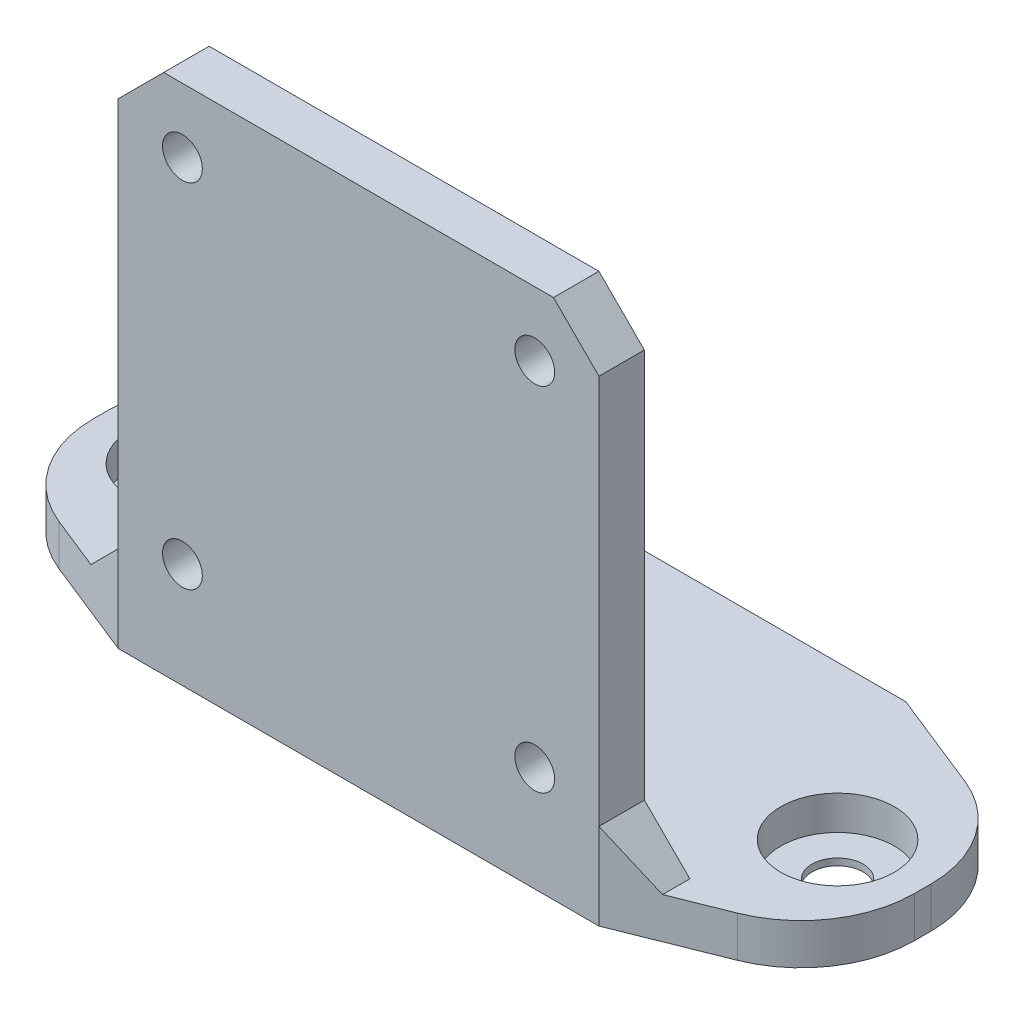
ISO-10303-21;
HEADER;
FILE_DESCRIPTION(('STEP AP214'),'2;1');
FILE_NAME('part.step','',(''),(''),'','','');
FILE_SCHEMA(('AUTOMOTIVE_DESIGN { 1 0 10303 214 1 1 1 1 }'));
ENDSEC;
DATA;
#1=APPLICATION_CONTEXT('core data for automotive mechanical design processes');
#2=APPLICATION_PROTOCOL_DEFINITION('international standard','automotive_design',2000,#1);
#3=PRODUCT_CONTEXT('',#1,'mechanical');
#4=PRODUCT('Part','Part','',(#3));
#5=PRODUCT_RELATED_PRODUCT_CATEGORY('part','',(#4));
#6=PRODUCT_DEFINITION_FORMATION('','',#4);
#7=PRODUCT_DEFINITION_CONTEXT('part definition',#1,'design');
#8=PRODUCT_DEFINITION('design','',#6,#7);
#9=PRODUCT_DEFINITION_SHAPE('','',#8);
#10=(LENGTH_UNIT() NAMED_UNIT(*) SI_UNIT(.MILLI.,.METRE.));
#11=(NAMED_UNIT(*) PLANE_ANGLE_UNIT() SI_UNIT($,.RADIAN.));
#12=(NAMED_UNIT(*) SI_UNIT($,.STERADIAN.) SOLID_ANGLE_UNIT());
#13=UNCERTAINTY_MEASURE_WITH_UNIT(LENGTH_MEASURE(1.E-05),#10,'distance_accuracy_value','');
#14=(GEOMETRIC_REPRESENTATION_CONTEXT(3) GLOBAL_UNCERTAINTY_ASSIGNED_CONTEXT((#13)) GLOBAL_UNIT_ASSIGNED_CONTEXT((#10,
#11,#12)) REPRESENTATION_CONTEXT('',''));
#15=CARTESIAN_POINT('',(0.,0.,0.));
#16=DIRECTION('',(0.,0.,1.));
#17=DIRECTION('',(1.,0.,0.));
#18=AXIS2_PLACEMENT_3D('',#15,#16,#17);
#19=CARTESIAN_POINT('',(0.,3.6,0.));
#20=DIRECTION('',(1.,0.,0.));
#21=DIRECTION('',(0.,0.,-1.));
#22=AXIS2_PLACEMENT_3D('',#19,#20,#21);
#23=PLANE('',#22);
#24=DIRECTION('',(0.,0.,1.));
#25=VECTOR('',#24,1.);
#26=CARTESIAN_POINT('',(0.,3.6,0.));
#27=LINE('',#26,#25);
#28=CARTESIAN_POINT('',(0.,3.6,12.770329614269));
#29=VERTEX_POINT('',#28);
#30=CARTESIAN_POINT('',(0.,3.6,14.229670385731));
#31=VERTEX_POINT('',#30);
#32=EDGE_CURVE('E200',#29,#31,#27,.T.);
#33=ORIENTED_EDGE('',*,*,#32,.F.);
#34=DIRECTION('',(0.,1.,0.));
#35=VECTOR('',#34,1.);
#36=CARTESIAN_POINT('',(0.,3.6,12.770329614269));
#37=LINE('',#36,#35);
#38=CARTESIAN_POINT('',(0.,0.,12.770329614269));
#39=VERTEX_POINT('',#38);
#40=EDGE_CURVE('E293',#29,#39,#37,.F.);
#41=ORIENTED_EDGE('',*,*,#40,.T.);
#42=DIRECTION('',(0.,0.,1.));
#43=VECTOR('',#42,1.);
#44=CARTESIAN_POINT('',(0.,0.,0.));
#45=LINE('',#44,#43);
#46=CARTESIAN_POINT('',(0.,0.,14.229670385731));
#47=VERTEX_POINT('',#46);
#48=EDGE_CURVE('E204',#39,#47,#45,.T.);
#49=ORIENTED_EDGE('',*,*,#48,.T.);
#50=DIRECTION('',(0.,1.,0.));
#51=VECTOR('',#50,1.);
#52=CARTESIAN_POINT('',(0.,3.6,14.229670385731));
#53=LINE('',#52,#51);
#54=EDGE_CURVE('E290',#47,#31,#53,.T.);
#55=ORIENTED_EDGE('',*,*,#54,.T.);
#56=EDGE_LOOP('',(#33,#41,#49,#55));
#57=FACE_BOUND('',#56,.T.);
#58=ADVANCED_FACE('F39',(#57),#23,.F.);
#59=CARTESIAN_POINT('',(0.,3.6,27.));
#60=DIRECTION('',(0.,0.,-1.));
#61=DIRECTION('',(-1.,0.,0.));
#62=AXIS2_PLACEMENT_3D('',#59,#60,#61);
#63=PLANE('',#62);
#64=CARTESIAN_POINT('',(20.65,9.24999999999999,27.));
#65=DIRECTION('',(0.,0.,1.));
#66=DIRECTION('',(1.,0.,0.));
#67=AXIS2_PLACEMENT_3D('',#64,#65,#66);
#68=CIRCLE('',#67,1.75);
#69=CARTESIAN_POINT('',(22.4,9.24999999999999,27.));
#70=VERTEX_POINT('',#69);
#71=EDGE_CURVE('E231',#70,#70,#68,.T.);
#72=ORIENTED_EDGE('',*,*,#71,.F.);
#73=EDGE_LOOP('',(#72));
#74=FACE_BOUND('',#73,.T.);
#75=CARTESIAN_POINT('',(51.65,9.24999999999999,27.));
#76=DIRECTION('',(0.,0.,1.));
#77=DIRECTION('',(1.,0.,0.));
#78=AXIS2_PLACEMENT_3D('',#75,#76,#77);
#79=CIRCLE('',#78,1.75);
#80=CARTESIAN_POINT('',(53.4,9.24999999999999,27.));
#81=VERTEX_POINT('',#80);
#82=EDGE_CURVE('E388',#81,#81,#79,.T.);
#83=ORIENTED_EDGE('',*,*,#82,.F.);
#84=EDGE_LOOP('',(#83));
#85=FACE_BOUND('',#84,.T.);
#86=CARTESIAN_POINT('',(51.65,40.25,27.));
#87=DIRECTION('',(0.,0.,1.));
#88=DIRECTION('',(1.,0.,0.));
#89=AXIS2_PLACEMENT_3D('',#86,#87,#88);
#90=CIRCLE('',#89,1.75);
#91=CARTESIAN_POINT('',(53.4,40.25,27.));
#92=VERTEX_POINT('',#91);
#93=EDGE_CURVE('E385',#92,#92,#90,.T.);
#94=ORIENTED_EDGE('',*,*,#93,.F.);
#95=EDGE_LOOP('',(#94));
#96=FACE_BOUND('',#95,.T.);
#97=CARTESIAN_POINT('',(20.65,40.25,27.));
#98=DIRECTION('',(0.,0.,1.));
#99=DIRECTION('',(1.,0.,0.));
#100=AXIS2_PLACEMENT_3D('',#97,#98,#99);
#101=CIRCLE('',#100,1.75);
#102=CARTESIAN_POINT('',(22.4,40.25,27.));
#103=VERTEX_POINT('',#102);
#104=EDGE_CURVE('E218',#103,#103,#101,.T.);
#105=ORIENTED_EDGE('',*,*,#104,.F.);
#106=EDGE_LOOP('',(#105));
#107=FACE_BOUND('',#106,.T.);
#108=DIRECTION('',(0.,-1.,0.));
#109=VECTOR('',#108,1.);
#110=CARTESIAN_POINT('',(57.3,45.9,27.));
#111=LINE('',#110,#109);
#112=CARTESIAN_POINT('',(57.3,41.9,27.));
#113=VERTEX_POINT('',#112);
#114=CARTESIAN_POINT('',(57.3,7.60000000000003,27.));
#115=VERTEX_POINT('',#114);
#116=EDGE_CURVE('E343',#113,#115,#111,.T.);
#117=ORIENTED_EDGE('',*,*,#116,.F.);
#118=DIRECTION('',(0.707106781186546,-0.707106781186549,0.));
#119=VECTOR('',#118,1.);
#120=CARTESIAN_POINT('',(53.3,45.9,27.));
#121=LINE('',#120,#119);
#122=CARTESIAN_POINT('',(53.3,45.9,27.));
#123=VERTEX_POINT('',#122);
#124=EDGE_CURVE('E258',#113,#123,#121,.F.);
#125=ORIENTED_EDGE('',*,*,#124,.T.);
#126=DIRECTION('',(1.,0.,0.));
#127=VECTOR('',#126,1.);
#128=CARTESIAN_POINT('',(15.,45.9,27.));
#129=LINE('',#128,#127);
#130=CARTESIAN_POINT('',(19.,45.9,27.));
#131=VERTEX_POINT('',#130);
#132=EDGE_CURVE('E346',#131,#123,#129,.T.);
#133=ORIENTED_EDGE('',*,*,#132,.F.);
#134=DIRECTION('',(0.707106781186546,0.707106781186549,0.));
#135=VECTOR('',#134,1.);
#136=CARTESIAN_POINT('',(19.,45.9,27.));
#137=LINE('',#136,#135);
#138=CARTESIAN_POINT('',(15.,41.9,27.));
#139=VERTEX_POINT('',#138);
#140=EDGE_CURVE('E256',#131,#139,#137,.F.);
#141=ORIENTED_EDGE('',*,*,#140,.T.);
#142=DIRECTION('',(0.,-1.,0.));
#143=VECTOR('',#142,1.);
#144=CARTESIAN_POINT('',(15.,45.9,27.));
#145=LINE('',#144,#143);
#146=CARTESIAN_POINT('',(15.,7.60000000000003,27.));
#147=VERTEX_POINT('',#146);
#148=EDGE_CURVE('E208',#139,#147,#145,.T.);
#149=ORIENTED_EDGE('',*,*,#148,.T.);
#150=DIRECTION('',(0.,1.,0.));
#151=VECTOR('',#150,1.);
#152=CARTESIAN_POINT('',(15.,-38.7,27.));
#153=LINE('',#152,#151);
#154=CARTESIAN_POINT('',(15.,0.,27.));
#155=VERTEX_POINT('',#154);
#156=EDGE_CURVE('E319',#155,#147,#153,.T.);
#157=ORIENTED_EDGE('',*,*,#156,.F.);
#158=DIRECTION('',(1.,0.,0.));
#159=VECTOR('',#158,1.);
#160=CARTESIAN_POINT('',(0.,0.,27.));
#161=LINE('',#160,#159);
#162=CARTESIAN_POINT('',(57.3,0.,27.));
#163=VERTEX_POINT('',#162);
#164=EDGE_CURVE('E207',#155,#163,#161,.T.);
#165=ORIENTED_EDGE('',*,*,#164,.T.);
#166=DIRECTION('',(0.,1.,0.));
#167=VECTOR('',#166,1.);
#168=CARTESIAN_POINT('',(57.3,-38.7,27.));
#169=LINE('',#168,#167);
#170=EDGE_CURVE('E56',#163,#115,#169,.T.);
#171=ORIENTED_EDGE('',*,*,#170,.T.);
#172=EDGE_LOOP('',(#117,#125,#133,#141,#149,#157,#165,#171));
#173=FACE_BOUND('',#172,.T.);
#174=ADVANCED_FACE('F366',(#74,#85,#96,#107,#173),#63,.F.);
#175=CARTESIAN_POINT('',(72.3,3.6,0.));
#176=DIRECTION('',(-1.,0.,0.));
#177=DIRECTION('',(0.,0.,1.));
#178=AXIS2_PLACEMENT_3D('',#175,#176,#177);
#179=PLANE('',#178);
#180=DIRECTION('',(0.,0.,-1.));
#181=VECTOR('',#180,1.);
#182=CARTESIAN_POINT('',(72.3,0.,0.));
#183=LINE('',#182,#181);
#184=CARTESIAN_POINT('',(72.3,0.,14.229670385731));
#185=VERTEX_POINT('',#184);
#186=CARTESIAN_POINT('',(72.3,0.,12.770329614269));
#187=VERTEX_POINT('',#186);
#188=EDGE_CURVE('E210',#185,#187,#183,.T.);
#189=ORIENTED_EDGE('',*,*,#188,.T.);
#190=DIRECTION('',(0.,1.,0.));
#191=VECTOR('',#190,1.);
#192=CARTESIAN_POINT('',(72.3,3.6,12.770329614269));
#193=LINE('',#192,#191);
#194=CARTESIAN_POINT('',(72.3,3.6,12.770329614269));
#195=VERTEX_POINT('',#194);
#196=EDGE_CURVE('E264',#187,#195,#193,.T.);
#197=ORIENTED_EDGE('',*,*,#196,.T.);
#198=DIRECTION('',(0.,0.,-1.));
#199=VECTOR('',#198,1.);
#200=CARTESIAN_POINT('',(72.3,3.6,0.));
#201=LINE('',#200,#199);
#202=CARTESIAN_POINT('',(72.3,3.6,14.229670385731));
#203=VERTEX_POINT('',#202);
#204=EDGE_CURVE('E194',#203,#195,#201,.T.);
#205=ORIENTED_EDGE('',*,*,#204,.F.);
#206=DIRECTION('',(0.,1.,0.));
#207=VECTOR('',#206,1.);
#208=CARTESIAN_POINT('',(72.3,3.6,14.229670385731));
#209=LINE('',#208,#207);
#210=EDGE_CURVE('E262',#203,#185,#209,.F.);
#211=ORIENTED_EDGE('',*,*,#210,.T.);
#212=EDGE_LOOP('',(#189,#197,#205,#211));
#213=FACE_BOUND('',#212,.T.);
#214=ADVANCED_FACE('F433',(#213),#179,.F.);
#215=CARTESIAN_POINT('',(0.,3.6,0.));
#216=DIRECTION('',(0.,0.,1.));
#217=DIRECTION('',(1.,0.,0.));
#218=AXIS2_PLACEMENT_3D('',#215,#216,#217);
#219=PLANE('',#218);
#220=DIRECTION('',(-1.,0.,0.));
#221=VECTOR('',#220,1.);
#222=CARTESIAN_POINT('',(0.,3.6,0.));
#223=LINE('',#222,#221);
#224=CARTESIAN_POINT('',(57.3,3.6,0.));
#225=VERTEX_POINT('',#224);
#226=CARTESIAN_POINT('',(15.,3.6,0.));
#227=VERTEX_POINT('',#226);
#228=EDGE_CURVE('E184',#225,#227,#223,.T.);
#229=ORIENTED_EDGE('',*,*,#228,.F.);
#230=DIRECTION('',(0.,1.,0.));
#231=VECTOR('',#230,1.);
#232=CARTESIAN_POINT('',(57.3,-38.7,0.));
#233=LINE('',#232,#231);
#234=CARTESIAN_POINT('',(57.3,0.,0.));
#235=VERTEX_POINT('',#234);
#236=EDGE_CURVE('E419',#235,#225,#233,.T.);
#237=ORIENTED_EDGE('',*,*,#236,.F.);
#238=DIRECTION('',(-1.,0.,0.));
#239=VECTOR('',#238,1.);
#240=CARTESIAN_POINT('',(0.,0.,0.));
#241=LINE('',#240,#239);
#242=CARTESIAN_POINT('',(15.,0.,0.));
#243=VERTEX_POINT('',#242);
#244=EDGE_CURVE('E186',#235,#243,#241,.T.);
#245=ORIENTED_EDGE('',*,*,#244,.T.);
#246=DIRECTION('',(0.,1.,0.));
#247=VECTOR('',#246,1.);
#248=CARTESIAN_POINT('',(15.,-38.7,0.));
#249=LINE('',#248,#247);
#250=EDGE_CURVE('E172',#243,#227,#249,.T.);
#251=ORIENTED_EDGE('',*,*,#250,.T.);
#252=EDGE_LOOP('',(#229,#237,#245,#251));
#253=FACE_BOUND('',#252,.T.);
#254=ADVANCED_FACE('F182',(#253),#219,.F.);
#255=CARTESIAN_POINT('',(0.,3.6,0.));
#256=DIRECTION('',(0.,1.,0.));
#257=DIRECTION('',(0.,0.,1.));
#258=AXIS2_PLACEMENT_3D('',#255,#256,#257);
#259=PLANE('',#258);
#260=DIRECTION('',(-1.,0.,0.));
#261=VECTOR('',#260,1.);
#262=CARTESIAN_POINT('',(15.,3.6,23.));
#263=LINE('',#262,#261);
#264=CARTESIAN_POINT('',(61.3,3.6,23.));
#265=VERTEX_POINT('',#264);
#266=CARTESIAN_POINT('',(11.,3.6,23.));
#267=VERTEX_POINT('',#266);
#268=EDGE_CURVE('E227',#265,#267,#263,.T.);
#269=ORIENTED_EDGE('',*,*,#268,.F.);
#270=DIRECTION('',(0.,0.,1.));
#271=VECTOR('',#270,1.);
#272=CARTESIAN_POINT('',(61.2999999999999,3.6,-1.06338549077378E-13));
#273=LINE('',#272,#271);
#274=CARTESIAN_POINT('',(61.3,3.6,25.4));
#275=VERTEX_POINT('',#274);
#276=EDGE_CURVE('E303',#265,#275,#273,.T.);
#277=ORIENTED_EDGE('',*,*,#276,.T.);
#278=DIRECTION('',(-0.928476690885259,0.,0.371390676354104));
#279=VECTOR('',#278,1.);
#280=CARTESIAN_POINT('',(72.3,3.6,21.));
#281=LINE('',#280,#279);
#282=CARTESIAN_POINT('',(66.013906763541,3.6,23.5144372945836));
#283=VERTEX_POINT('',#282);
#284=EDGE_CURVE('E415',#283,#275,#281,.T.);
#285=ORIENTED_EDGE('',*,*,#284,.F.);
#286=CARTESIAN_POINT('',(62.3,3.6,14.229670385731));
#287=DIRECTION('',(0.,1.,0.));
#288=DIRECTION('',(0.,0.,1.));
#289=AXIS2_PLACEMENT_3D('',#286,#287,#288);
#290=CIRCLE('',#289,10.);
#291=EDGE_CURVE('E272',#283,#203,#290,.T.);
#292=ORIENTED_EDGE('',*,*,#291,.T.);
#293=ORIENTED_EDGE('',*,*,#204,.T.);
#294=CARTESIAN_POINT('',(62.3,3.6,12.770329614269));
#295=DIRECTION('',(0.,1.,0.));
#296=DIRECTION('',(0.,0.,1.));
#297=AXIS2_PLACEMENT_3D('',#294,#295,#296);
#298=CIRCLE('',#297,10.);
#299=CARTESIAN_POINT('',(66.013906763541,3.6,3.48556270541642));
#300=VERTEX_POINT('',#299);
#301=EDGE_CURVE('E274',#195,#300,#298,.T.);
#302=ORIENTED_EDGE('',*,*,#301,.T.);
#303=DIRECTION('',(0.928476690885259,0.,0.371390676354104));
#304=VECTOR('',#303,1.);
#305=CARTESIAN_POINT('',(72.3,3.6,6.));
#306=LINE('',#305,#304);
#307=EDGE_CURVE('E187',#225,#300,#306,.T.);
#308=ORIENTED_EDGE('',*,*,#307,.F.);
#309=ORIENTED_EDGE('',*,*,#228,.T.);
#310=DIRECTION('',(0.92847669088526,0.,-0.371390676354103));
#311=VECTOR('',#310,1.);
#312=CARTESIAN_POINT('',(15.,3.6,0.));
#313=LINE('',#312,#311);
#314=CARTESIAN_POINT('',(6.28609323645896,3.6,3.48556270541642));
#315=VERTEX_POINT('',#314);
#316=EDGE_CURVE('E168',#315,#227,#313,.T.);
#317=ORIENTED_EDGE('',*,*,#316,.F.);
#318=CARTESIAN_POINT('',(10.,3.6,12.770329614269));
#319=DIRECTION('',(0.,1.,0.));
#320=DIRECTION('',(0.,0.,1.));
#321=AXIS2_PLACEMENT_3D('',#318,#319,#320);
#322=CIRCLE('',#321,10.);
#323=EDGE_CURVE('E270',#315,#29,#322,.T.);
#324=ORIENTED_EDGE('',*,*,#323,.T.);
#325=ORIENTED_EDGE('',*,*,#32,.T.);
#326=CARTESIAN_POINT('',(10.,3.6,14.229670385731));
#327=DIRECTION('',(0.,1.,0.));
#328=DIRECTION('',(0.,0.,1.));
#329=AXIS2_PLACEMENT_3D('',#326,#327,#328);
#330=CIRCLE('',#329,10.);
#331=CARTESIAN_POINT('',(6.28609323645896,3.6,23.5144372945836));
#332=VERTEX_POINT('',#331);
#333=EDGE_CURVE('E267',#31,#332,#330,.T.);
#334=ORIENTED_EDGE('',*,*,#333,.T.);
#335=DIRECTION('',(-0.928476690885259,0.,-0.371390676354104));
#336=VECTOR('',#335,1.);
#337=CARTESIAN_POINT('',(15.,3.6,27.));
#338=LINE('',#337,#336);
#339=CARTESIAN_POINT('',(11.,3.6,25.4));
#340=VERTEX_POINT('',#339);
#341=EDGE_CURVE('E178',#340,#332,#338,.T.);
#342=ORIENTED_EDGE('',*,*,#341,.F.);
#343=DIRECTION('',(0.,0.,-1.));
#344=VECTOR('',#343,1.);
#345=CARTESIAN_POINT('',(11.,3.6,0.));
#346=LINE('',#345,#344);
#347=EDGE_CURVE('E300',#340,#267,#346,.T.);
#348=ORIENTED_EDGE('',*,*,#347,.T.);
#349=EDGE_LOOP('',(#269,#277,#285,#292,#293,#302,#308,#309,#317,#324,#325,#334,#342,#348));
#350=FACE_BOUND('',#349,.T.);
#351=CARTESIAN_POINT('',(7.50000000000001,3.6,13.5));
#352=DIRECTION('',(0.,1.,0.));
#353=DIRECTION('',(0.,0.,1.));
#354=AXIS2_PLACEMENT_3D('',#351,#352,#353);
#355=CIRCLE('',#354,5.);
#356=CARTESIAN_POINT('',(7.50000000000001,3.6,18.5));
#357=VERTEX_POINT('',#356);
#358=EDGE_CURVE('E367',#357,#357,#355,.T.);
#359=ORIENTED_EDGE('',*,*,#358,.F.);
#360=EDGE_LOOP('',(#359));
#361=FACE_BOUND('',#360,.T.);
#362=CARTESIAN_POINT('',(64.8,3.6,13.5));
#363=DIRECTION('',(0.,1.,0.));
#364=DIRECTION('',(0.,0.,1.));
#365=AXIS2_PLACEMENT_3D('',#362,#363,#364);
#366=CIRCLE('',#365,5.);
#367=CARTESIAN_POINT('',(64.8,3.6,18.5));
#368=VERTEX_POINT('',#367);
#369=EDGE_CURVE('E235',#368,#368,#366,.T.);
#370=ORIENTED_EDGE('',*,*,#369,.F.);
#371=EDGE_LOOP('',(#370));
#372=FACE_BOUND('',#371,.T.);
#373=ADVANCED_FACE('F190',(#350,#361,#372),#259,.T.);
#374=CARTESIAN_POINT('',(0.,0.,0.));
#375=DIRECTION('',(0.,1.,0.));
#376=DIRECTION('',(0.,0.,1.));
#377=AXIS2_PLACEMENT_3D('',#374,#375,#376);
#378=PLANE('',#377);
#379=CARTESIAN_POINT('',(7.50000000000001,0.,13.5));
#380=DIRECTION('',(0.,1.,0.));
#381=DIRECTION('',(0.,0.,1.));
#382=AXIS2_PLACEMENT_3D('',#379,#380,#381);
#383=CIRCLE('',#382,2.25);
#384=CARTESIAN_POINT('',(7.50000000000001,0.,15.75));
#385=VERTEX_POINT('',#384);
#386=EDGE_CURVE('E233',#385,#385,#383,.T.);
#387=ORIENTED_EDGE('',*,*,#386,.T.);
#388=EDGE_LOOP('',(#387));
#389=FACE_BOUND('',#388,.T.);
#390=CARTESIAN_POINT('',(64.8,0.,13.5));
#391=DIRECTION('',(0.,1.,0.));
#392=DIRECTION('',(0.,0.,1.));
#393=AXIS2_PLACEMENT_3D('',#390,#391,#392);
#394=CIRCLE('',#393,2.25);
#395=CARTESIAN_POINT('',(64.8,0.,15.75));
#396=VERTEX_POINT('',#395);
#397=EDGE_CURVE('E228',#396,#396,#394,.T.);
#398=ORIENTED_EDGE('',*,*,#397,.T.);
#399=EDGE_LOOP('',(#398));
#400=FACE_BOUND('',#399,.T.);
#401=DIRECTION('',(0.928476690885259,0.,0.371390676354104));
#402=VECTOR('',#401,1.);
#403=CARTESIAN_POINT('',(7.90344827586207,0.,-19.7586206896552));
#404=LINE('',#403,#402);
#405=CARTESIAN_POINT('',(66.013906763541,0.,3.48556270541642));
#406=VERTEX_POINT('',#405);
#407=EDGE_CURVE('E239',#235,#406,#404,.T.);
#408=ORIENTED_EDGE('',*,*,#407,.T.);
#409=CARTESIAN_POINT('',(62.3,0.,12.770329614269));
#410=DIRECTION('',(0.,1.,0.));
#411=DIRECTION('',(0.,0.,1.));
#412=AXIS2_PLACEMENT_3D('',#409,#410,#411);
#413=CIRCLE('',#412,10.);
#414=EDGE_CURVE('E284',#406,#187,#413,.F.);
#415=ORIENTED_EDGE('',*,*,#414,.T.);
#416=ORIENTED_EDGE('',*,*,#188,.F.);
#417=CARTESIAN_POINT('',(62.3,0.,14.229670385731));
#418=DIRECTION('',(0.,1.,0.));
#419=DIRECTION('',(0.,0.,1.));
#420=AXIS2_PLACEMENT_3D('',#417,#418,#419);
#421=CIRCLE('',#420,10.);
#422=CARTESIAN_POINT('',(66.0139067635411,0.,23.5144372945836));
#423=VERTEX_POINT('',#422);
#424=EDGE_CURVE('E282',#185,#423,#421,.F.);
#425=ORIENTED_EDGE('',*,*,#424,.T.);
#426=DIRECTION('',(-0.928476690885259,0.,0.371390676354104));
#427=VECTOR('',#426,1.);
#428=CARTESIAN_POINT('',(17.2137931034483,0.,43.0344827586207));
#429=LINE('',#428,#427);
#430=EDGE_CURVE('E242',#423,#163,#429,.T.);
#431=ORIENTED_EDGE('',*,*,#430,.T.);
#432=ORIENTED_EDGE('',*,*,#164,.F.);
#433=DIRECTION('',(-0.928476690885259,0.,-0.371390676354104));
#434=VECTOR('',#433,1.);
#435=CARTESIAN_POINT('',(-7.24137931034483,0.,18.1034482758621));
#436=LINE('',#435,#434);
#437=CARTESIAN_POINT('',(6.28609323645897,0.,23.5144372945836));
#438=VERTEX_POINT('',#437);
#439=EDGE_CURVE('E193',#155,#438,#436,.T.);
#440=ORIENTED_EDGE('',*,*,#439,.T.);
#441=CARTESIAN_POINT('',(10.,0.,14.229670385731));
#442=DIRECTION('',(0.,1.,0.));
#443=DIRECTION('',(0.,0.,1.));
#444=AXIS2_PLACEMENT_3D('',#441,#442,#443);
#445=CIRCLE('',#444,10.);
#446=EDGE_CURVE('E278',#438,#47,#445,.F.);
#447=ORIENTED_EDGE('',*,*,#446,.T.);
#448=ORIENTED_EDGE('',*,*,#48,.F.);
#449=CARTESIAN_POINT('',(10.,0.,12.770329614269));
#450=DIRECTION('',(0.,1.,0.));
#451=DIRECTION('',(0.,0.,1.));
#452=AXIS2_PLACEMENT_3D('',#449,#450,#451);
#453=CIRCLE('',#452,10.);
#454=CARTESIAN_POINT('',(6.28609323645897,0.,3.48556270541641));
#455=VERTEX_POINT('',#454);
#456=EDGE_CURVE('E280',#39,#455,#453,.F.);
#457=ORIENTED_EDGE('',*,*,#456,.T.);
#458=DIRECTION('',(0.928476690885259,0.,-0.371390676354103));
#459=VECTOR('',#458,1.);
#460=CARTESIAN_POINT('',(2.06896551724138,0.,5.17241379310345));
#461=LINE('',#460,#459);
#462=EDGE_CURVE('E197',#455,#243,#461,.T.);
#463=ORIENTED_EDGE('',*,*,#462,.T.);
#464=ORIENTED_EDGE('',*,*,#244,.F.);
#465=EDGE_LOOP('',(#408,#415,#416,#425,#431,#432,#440,#447,#448,#457,#463,#464));
#466=FACE_BOUND('',#465,.T.);
#467=ADVANCED_FACE('F360',(#389,#400,#466),#378,.F.);
#468=CARTESIAN_POINT('',(15.,45.9,27.));
#469=DIRECTION('',(1.,0.,0.));
#470=DIRECTION('',(0.,0.,-1.));
#471=AXIS2_PLACEMENT_3D('',#468,#469,#470);
#472=PLANE('',#471);
#473=DIRECTION('',(0.,-1.,0.));
#474=VECTOR('',#473,1.);
#475=CARTESIAN_POINT('',(15.,45.9,23.));
#476=LINE('',#475,#474);
#477=CARTESIAN_POINT('',(15.,41.9,23.));
#478=VERTEX_POINT('',#477);
#479=CARTESIAN_POINT('',(15.,7.60000000000003,23.));
#480=VERTEX_POINT('',#479);
#481=EDGE_CURVE('E332',#478,#480,#476,.T.);
#482=ORIENTED_EDGE('',*,*,#481,.T.);
#483=DIRECTION('',(0.,0.,1.));
#484=VECTOR('',#483,1.);
#485=CARTESIAN_POINT('',(15.,7.60000000000003,27.));
#486=LINE('',#485,#484);
#487=EDGE_CURVE('E305',#480,#147,#486,.T.);
#488=ORIENTED_EDGE('',*,*,#487,.T.);
#489=ORIENTED_EDGE('',*,*,#148,.F.);
#490=DIRECTION('',(0.,0.,-1.));
#491=VECTOR('',#490,1.);
#492=CARTESIAN_POINT('',(15.,41.9,27.));
#493=LINE('',#492,#491);
#494=EDGE_CURVE('E260',#139,#478,#493,.T.);
#495=ORIENTED_EDGE('',*,*,#494,.T.);
#496=EDGE_LOOP('',(#482,#488,#489,#495));
#497=FACE_BOUND('',#496,.T.);
#498=ADVANCED_FACE('F335',(#497),#472,.F.);
#499=CARTESIAN_POINT('',(57.3,45.9,27.));
#500=DIRECTION('',(-1.,0.,0.));
#501=DIRECTION('',(0.,0.,1.));
#502=AXIS2_PLACEMENT_3D('',#499,#500,#501);
#503=PLANE('',#502);
#504=ORIENTED_EDGE('',*,*,#116,.T.);
#505=DIRECTION('',(0.,0.,-1.));
#506=VECTOR('',#505,1.);
#507=CARTESIAN_POINT('',(57.3,7.60000000000003,27.));
#508=LINE('',#507,#506);
#509=CARTESIAN_POINT('',(57.3,7.60000000000003,23.));
#510=VERTEX_POINT('',#509);
#511=EDGE_CURVE('E297',#115,#510,#508,.T.);
#512=ORIENTED_EDGE('',*,*,#511,.T.);
#513=DIRECTION('',(0.,-1.,0.));
#514=VECTOR('',#513,1.);
#515=CARTESIAN_POINT('',(57.3,45.9,23.));
#516=LINE('',#515,#514);
#517=CARTESIAN_POINT('',(57.3,41.9,23.));
#518=VERTEX_POINT('',#517);
#519=EDGE_CURVE('E339',#518,#510,#516,.T.);
#520=ORIENTED_EDGE('',*,*,#519,.F.);
#521=DIRECTION('',(0.,0.,1.));
#522=VECTOR('',#521,1.);
#523=CARTESIAN_POINT('',(57.3,41.9,27.));
#524=LINE('',#523,#522);
#525=EDGE_CURVE('E254',#518,#113,#524,.T.);
#526=ORIENTED_EDGE('',*,*,#525,.T.);
#527=EDGE_LOOP('',(#504,#512,#520,#526));
#528=FACE_BOUND('',#527,.T.);
#529=ADVANCED_FACE('F407',(#528),#503,.F.);
#530=CARTESIAN_POINT('',(15.,45.9,23.));
#531=DIRECTION('',(0.,0.,1.));
#532=DIRECTION('',(1.,0.,0.));
#533=AXIS2_PLACEMENT_3D('',#530,#531,#532);
#534=PLANE('',#533);
#535=CARTESIAN_POINT('',(20.65,9.24999999999999,23.));
#536=DIRECTION('',(0.,0.,1.));
#537=DIRECTION('',(1.,0.,0.));
#538=AXIS2_PLACEMENT_3D('',#535,#536,#537);
#539=CIRCLE('',#538,1.75);
#540=CARTESIAN_POINT('',(22.4,9.24999999999999,23.));
#541=VERTEX_POINT('',#540);
#542=EDGE_CURVE('E224',#541,#541,#539,.T.);
#543=ORIENTED_EDGE('',*,*,#542,.T.);
#544=EDGE_LOOP('',(#543));
#545=FACE_BOUND('',#544,.T.);
#546=CARTESIAN_POINT('',(51.65,9.24999999999999,23.));
#547=DIRECTION('',(0.,0.,1.));
#548=DIRECTION('',(1.,0.,0.));
#549=AXIS2_PLACEMENT_3D('',#546,#547,#548);
#550=CIRCLE('',#549,1.75);
#551=CARTESIAN_POINT('',(53.4,9.24999999999999,23.));
#552=VERTEX_POINT('',#551);
#553=EDGE_CURVE('E221',#552,#552,#550,.T.);
#554=ORIENTED_EDGE('',*,*,#553,.T.);
#555=EDGE_LOOP('',(#554));
#556=FACE_BOUND('',#555,.T.);
#557=CARTESIAN_POINT('',(51.65,40.25,23.));
#558=DIRECTION('',(0.,0.,1.));
#559=DIRECTION('',(1.,0.,0.));
#560=AXIS2_PLACEMENT_3D('',#557,#558,#559);
#561=CIRCLE('',#560,1.75);
#562=CARTESIAN_POINT('',(53.4,40.25,23.));
#563=VERTEX_POINT('',#562);
#564=EDGE_CURVE('E217',#563,#563,#561,.T.);
#565=ORIENTED_EDGE('',*,*,#564,.T.);
#566=EDGE_LOOP('',(#565));
#567=FACE_BOUND('',#566,.T.);
#568=CARTESIAN_POINT('',(20.65,40.25,23.));
#569=DIRECTION('',(0.,0.,1.));
#570=DIRECTION('',(1.,0.,0.));
#571=AXIS2_PLACEMENT_3D('',#568,#569,#570);
#572=CIRCLE('',#571,1.75);
#573=CARTESIAN_POINT('',(22.4,40.25,23.));
#574=VERTEX_POINT('',#573);
#575=EDGE_CURVE('E214',#574,#574,#572,.T.);
#576=ORIENTED_EDGE('',*,*,#575,.T.);
#577=EDGE_LOOP('',(#576));
#578=FACE_BOUND('',#577,.T.);
#579=DIRECTION('',(-1.,0.,0.));
#580=VECTOR('',#579,1.);
#581=CARTESIAN_POINT('',(15.,45.9,23.));
#582=LINE('',#581,#580);
#583=CARTESIAN_POINT('',(53.3,45.9,23.));
#584=VERTEX_POINT('',#583);
#585=CARTESIAN_POINT('',(19.,45.9,23.));
#586=VERTEX_POINT('',#585);
#587=EDGE_CURVE('E340',#584,#586,#582,.T.);
#588=ORIENTED_EDGE('',*,*,#587,.F.);
#589=DIRECTION('',(-0.707106781186546,0.707106781186549,0.));
#590=VECTOR('',#589,1.);
#591=CARTESIAN_POINT('',(53.3,45.9,23.));
#592=LINE('',#591,#590);
#593=EDGE_CURVE('E252',#584,#518,#592,.F.);
#594=ORIENTED_EDGE('',*,*,#593,.T.);
#595=ORIENTED_EDGE('',*,*,#519,.T.);
#596=DIRECTION('',(0.707106781186544,-0.707106781186551,0.));
#597=VECTOR('',#596,1.);
#598=CARTESIAN_POINT('',(17.0000000000002,47.9000000000002,23.));
#599=LINE('',#598,#597);
#600=EDGE_CURVE('E308',#510,#265,#599,.T.);
#601=ORIENTED_EDGE('',*,*,#600,.T.);
#602=ORIENTED_EDGE('',*,*,#268,.T.);
#603=DIRECTION('',(0.707106781186544,0.707106781186551,0.));
#604=VECTOR('',#603,1.);
#605=CARTESIAN_POINT('',(34.15,26.7500000000002,23.));
#606=LINE('',#605,#604);
#607=EDGE_CURVE('E11',#267,#480,#606,.T.);
#608=ORIENTED_EDGE('',*,*,#607,.T.);
#609=ORIENTED_EDGE('',*,*,#481,.F.);
#610=DIRECTION('',(-0.707106781186546,-0.707106781186549,0.));
#611=VECTOR('',#610,1.);
#612=CARTESIAN_POINT('',(19.,45.9,23.));
#613=LINE('',#612,#611);
#614=EDGE_CURVE('E250',#478,#586,#613,.F.);
#615=ORIENTED_EDGE('',*,*,#614,.T.);
#616=EDGE_LOOP('',(#588,#594,#595,#601,#602,#608,#609,#615));
#617=FACE_BOUND('',#616,.T.);
#618=ADVANCED_FACE('F331',(#545,#556,#567,#578,#617),#534,.F.);
#619=CARTESIAN_POINT('',(0.,45.9,0.));
#620=DIRECTION('',(0.,-1.,0.));
#621=DIRECTION('',(0.,0.,-1.));
#622=AXIS2_PLACEMENT_3D('',#619,#620,#621);
#623=PLANE('',#622);
#624=ORIENTED_EDGE('',*,*,#132,.T.);
#625=DIRECTION('',(0.,0.,-1.));
#626=VECTOR('',#625,1.);
#627=CARTESIAN_POINT('',(53.3,45.9,0.));
#628=LINE('',#627,#626);
#629=EDGE_CURVE('E247',#123,#584,#628,.T.);
#630=ORIENTED_EDGE('',*,*,#629,.T.);
#631=ORIENTED_EDGE('',*,*,#587,.T.);
#632=DIRECTION('',(0.,0.,1.));
#633=VECTOR('',#632,1.);
#634=CARTESIAN_POINT('',(19.,45.9,0.));
#635=LINE('',#634,#633);
#636=EDGE_CURVE('E244',#586,#131,#635,.T.);
#637=ORIENTED_EDGE('',*,*,#636,.T.);
#638=EDGE_LOOP('',(#624,#630,#631,#637));
#639=FACE_BOUND('',#638,.T.);
#640=ADVANCED_FACE('F399',(#639),#623,.F.);
#641=CARTESIAN_POINT('',(20.65,40.25,-15.3));
#642=DIRECTION('',(0.,0.,1.));
#643=DIRECTION('',(1.,0.,0.));
#644=AXIS2_PLACEMENT_3D('',#641,#642,#643);
#645=CYLINDRICAL_SURFACE('',#644,1.75);
#646=ORIENTED_EDGE('',*,*,#104,.T.);
#647=EDGE_LOOP('',(#646));
#648=FACE_BOUND('',#647,.T.);
#649=ORIENTED_EDGE('',*,*,#575,.F.);
#650=EDGE_LOOP('',(#649));
#651=FACE_BOUND('',#650,.T.);
#652=ADVANCED_FACE('F706',(#648,#651),#645,.F.);
#653=CARTESIAN_POINT('',(51.65,40.25,-15.3));
#654=DIRECTION('',(0.,0.,1.));
#655=DIRECTION('',(1.,0.,0.));
#656=AXIS2_PLACEMENT_3D('',#653,#654,#655);
#657=CYLINDRICAL_SURFACE('',#656,1.75);
#658=ORIENTED_EDGE('',*,*,#93,.T.);
#659=EDGE_LOOP('',(#658));
#660=FACE_BOUND('',#659,.T.);
#661=ORIENTED_EDGE('',*,*,#564,.F.);
#662=EDGE_LOOP('',(#661));
#663=FACE_BOUND('',#662,.T.);
#664=ADVANCED_FACE('F696',(#660,#663),#657,.F.);
#665=CARTESIAN_POINT('',(51.65,9.24999999999999,-15.3));
#666=DIRECTION('',(0.,0.,1.));
#667=DIRECTION('',(1.,0.,0.));
#668=AXIS2_PLACEMENT_3D('',#665,#666,#667);
#669=CYLINDRICAL_SURFACE('',#668,1.75);
#670=ORIENTED_EDGE('',*,*,#82,.T.);
#671=EDGE_LOOP('',(#670));
#672=FACE_BOUND('',#671,.T.);
#673=ORIENTED_EDGE('',*,*,#553,.F.);
#674=EDGE_LOOP('',(#673));
#675=FACE_BOUND('',#674,.T.);
#676=ADVANCED_FACE('F686',(#672,#675),#669,.F.);
#677=CARTESIAN_POINT('',(20.65,9.24999999999999,-15.3));
#678=DIRECTION('',(0.,0.,1.));
#679=DIRECTION('',(1.,0.,0.));
#680=AXIS2_PLACEMENT_3D('',#677,#678,#679);
#681=CYLINDRICAL_SURFACE('',#680,1.75);
#682=ORIENTED_EDGE('',*,*,#71,.T.);
#683=EDGE_LOOP('',(#682));
#684=FACE_BOUND('',#683,.T.);
#685=ORIENTED_EDGE('',*,*,#542,.F.);
#686=EDGE_LOOP('',(#685));
#687=FACE_BOUND('',#686,.T.);
#688=ADVANCED_FACE('F676',(#684,#687),#681,.F.);
#689=CARTESIAN_POINT('',(64.8,3.6,13.5));
#690=DIRECTION('',(0.,1.,0.));
#691=DIRECTION('',(0.,0.,1.));
#692=AXIS2_PLACEMENT_3D('',#689,#690,#691);
#693=CYLINDRICAL_SURFACE('',#692,2.25);
#694=CARTESIAN_POINT('',(64.8,0.600000000000001,13.5));
#695=DIRECTION('',(0.,1.,0.));
#696=DIRECTION('',(0.,0.,1.));
#697=AXIS2_PLACEMENT_3D('',#694,#695,#696);
#698=CIRCLE('',#697,2.25);
#699=CARTESIAN_POINT('',(64.8,0.600000000000001,15.75));
#700=VERTEX_POINT('',#699);
#701=EDGE_CURVE('E232',#700,#700,#698,.T.);
#702=ORIENTED_EDGE('',*,*,#701,.T.);
#703=EDGE_LOOP('',(#702));
#704=FACE_BOUND('',#703,.T.);
#705=ORIENTED_EDGE('',*,*,#397,.F.);
#706=EDGE_LOOP('',(#705));
#707=FACE_BOUND('',#706,.T.);
#708=ADVANCED_FACE('F666',(#704,#707),#693,.F.);
#709=CARTESIAN_POINT('',(67.05,0.600000000000001,13.5));
#710=DIRECTION('',(0.,-1.,0.));
#711=DIRECTION('',(0.,0.,-1.));
#712=AXIS2_PLACEMENT_3D('',#709,#710,#711);
#713=PLANE('',#712);
#714=ORIENTED_EDGE('',*,*,#701,.F.);
#715=EDGE_LOOP('',(#714));
#716=FACE_BOUND('',#715,.T.);
#717=CARTESIAN_POINT('',(64.8,0.6,13.5));
#718=DIRECTION('',(0.,1.,0.));
#719=DIRECTION('',(0.,0.,1.));
#720=AXIS2_PLACEMENT_3D('',#717,#718,#719);
#721=CIRCLE('',#720,5.);
#722=CARTESIAN_POINT('',(64.8,0.6,18.5));
#723=VERTEX_POINT('',#722);
#724=EDGE_CURVE('E380',#723,#723,#721,.T.);
#725=ORIENTED_EDGE('',*,*,#724,.T.);
#726=EDGE_LOOP('',(#725));
#727=FACE_BOUND('',#726,.T.);
#728=ADVANCED_FACE('F656',(#716,#727),#713,.F.);
#729=CARTESIAN_POINT('',(64.8,3.6,13.5));
#730=DIRECTION('',(0.,1.,0.));
#731=DIRECTION('',(0.,0.,1.));
#732=AXIS2_PLACEMENT_3D('',#729,#730,#731);
#733=CYLINDRICAL_SURFACE('',#732,5.);
#734=ORIENTED_EDGE('',*,*,#724,.F.);
#735=EDGE_LOOP('',(#734));
#736=FACE_BOUND('',#735,.T.);
#737=ORIENTED_EDGE('',*,*,#369,.T.);
#738=EDGE_LOOP('',(#737));
#739=FACE_BOUND('',#738,.T.);
#740=ADVANCED_FACE('F646',(#736,#739),#733,.F.);
#741=CARTESIAN_POINT('',(7.50000000000001,3.6,13.5));
#742=DIRECTION('',(0.,1.,0.));
#743=DIRECTION('',(0.,0.,1.));
#744=AXIS2_PLACEMENT_3D('',#741,#742,#743);
#745=CYLINDRICAL_SURFACE('',#744,2.25);
#746=CARTESIAN_POINT('',(7.50000000000001,0.600000000000001,13.5));
#747=DIRECTION('',(0.,1.,0.));
#748=DIRECTION('',(0.,0.,1.));
#749=AXIS2_PLACEMENT_3D('',#746,#747,#748);
#750=CIRCLE('',#749,2.25);
#751=CARTESIAN_POINT('',(7.50000000000001,0.600000000000001,15.75));
#752=VERTEX_POINT('',#751);
#753=EDGE_CURVE('E236',#752,#752,#750,.T.);
#754=ORIENTED_EDGE('',*,*,#753,.T.);
#755=EDGE_LOOP('',(#754));
#756=FACE_BOUND('',#755,.T.);
#757=ORIENTED_EDGE('',*,*,#386,.F.);
#758=EDGE_LOOP('',(#757));
#759=FACE_BOUND('',#758,.T.);
#760=ADVANCED_FACE('F636',(#756,#759),#745,.F.);
#761=CARTESIAN_POINT('',(9.75000000000001,0.600000000000001,13.5));
#762=DIRECTION('',(0.,-1.,0.));
#763=DIRECTION('',(0.,0.,-1.));
#764=AXIS2_PLACEMENT_3D('',#761,#762,#763);
#765=PLANE('',#764);
#766=ORIENTED_EDGE('',*,*,#753,.F.);
#767=EDGE_LOOP('',(#766));
#768=FACE_BOUND('',#767,.T.);
#769=CARTESIAN_POINT('',(7.50000000000001,0.6,13.5));
#770=DIRECTION('',(0.,1.,0.));
#771=DIRECTION('',(0.,0.,1.));
#772=AXIS2_PLACEMENT_3D('',#769,#770,#771);
#773=CIRCLE('',#772,5.);
#774=CARTESIAN_POINT('',(7.50000000000001,0.6,18.5));
#775=VERTEX_POINT('',#774);
#776=EDGE_CURVE('E370',#775,#775,#773,.T.);
#777=ORIENTED_EDGE('',*,*,#776,.T.);
#778=EDGE_LOOP('',(#777));
#779=FACE_BOUND('',#778,.T.);
#780=ADVANCED_FACE('F626',(#768,#779),#765,.F.);
#781=CARTESIAN_POINT('',(7.50000000000001,3.6,13.5));
#782=DIRECTION('',(0.,1.,0.));
#783=DIRECTION('',(0.,0.,1.));
#784=AXIS2_PLACEMENT_3D('',#781,#782,#783);
#785=CYLINDRICAL_SURFACE('',#784,5.);
#786=ORIENTED_EDGE('',*,*,#776,.F.);
#787=EDGE_LOOP('',(#786));
#788=FACE_BOUND('',#787,.T.);
#789=ORIENTED_EDGE('',*,*,#358,.T.);
#790=EDGE_LOOP('',(#789));
#791=FACE_BOUND('',#790,.T.);
#792=ADVANCED_FACE('F565',(#788,#791),#785,.F.);
#793=CARTESIAN_POINT('',(15.,-38.7,27.));
#794=DIRECTION('',(0.371390676354104,0.,-0.928476690885259));
#795=DIRECTION('',(-0.928476690885259,0.,-0.371390676354104));
#796=AXIS2_PLACEMENT_3D('',#793,#794,#795);
#797=PLANE('',#796);
#798=ORIENTED_EDGE('',*,*,#156,.T.);
#799=DIRECTION('',(-0.680413817439768,-0.680413817439775,-0.272165526975908));
#800=VECTOR('',#799,1.);
#801=CARTESIAN_POINT('',(-6.4351851851852,-13.8351851851854,18.4259259259259));
#802=LINE('',#801,#800);
#803=EDGE_CURVE('E49',#147,#340,#802,.T.);
#804=ORIENTED_EDGE('',*,*,#803,.T.);
#805=ORIENTED_EDGE('',*,*,#341,.T.);
#806=DIRECTION('',(0.,1.,0.));
#807=VECTOR('',#806,1.);
#808=CARTESIAN_POINT('',(6.28609323645896,-38.7,23.5144372945836));
#809=LINE('',#808,#807);
#810=EDGE_CURVE('E295',#332,#438,#809,.F.);
#811=ORIENTED_EDGE('',*,*,#810,.T.);
#812=ORIENTED_EDGE('',*,*,#439,.F.);
#813=EDGE_LOOP('',(#798,#804,#805,#811,#812));
#814=FACE_BOUND('',#813,.T.);
#815=ADVANCED_FACE('F317',(#814),#797,.F.);
#816=CARTESIAN_POINT('',(15.,-38.7,0.));
#817=DIRECTION('',(0.371390676354103,0.,0.928476690885259));
#818=DIRECTION('',(0.928476690885259,0.,-0.371390676354103));
#819=AXIS2_PLACEMENT_3D('',#816,#817,#818);
#820=PLANE('',#819);
#821=ORIENTED_EDGE('',*,*,#462,.F.);
#822=DIRECTION('',(0.,1.,0.));
#823=VECTOR('',#822,1.);
#824=CARTESIAN_POINT('',(6.28609323645897,-38.7,3.48556270541642));
#825=LINE('',#824,#823);
#826=EDGE_CURVE('E175',#455,#315,#825,.T.);
#827=ORIENTED_EDGE('',*,*,#826,.T.);
#828=ORIENTED_EDGE('',*,*,#316,.T.);
#829=ORIENTED_EDGE('',*,*,#250,.F.);
#830=EDGE_LOOP('',(#821,#827,#828,#829));
#831=FACE_BOUND('',#830,.T.);
#832=ADVANCED_FACE('F171',(#831),#820,.F.);
#833=CARTESIAN_POINT('',(72.3,-38.7,6.));
#834=DIRECTION('',(-0.371390676354104,0.,0.928476690885259));
#835=DIRECTION('',(0.928476690885259,0.,0.371390676354104));
#836=AXIS2_PLACEMENT_3D('',#833,#834,#835);
#837=PLANE('',#836);
#838=ORIENTED_EDGE('',*,*,#307,.T.);
#839=DIRECTION('',(0.,1.,0.));
#840=VECTOR('',#839,1.);
#841=CARTESIAN_POINT('',(66.013906763541,-38.7,3.48556270541642));
#842=LINE('',#841,#840);
#843=EDGE_CURVE('E276',#300,#406,#842,.F.);
#844=ORIENTED_EDGE('',*,*,#843,.T.);
#845=ORIENTED_EDGE('',*,*,#407,.F.);
#846=ORIENTED_EDGE('',*,*,#236,.T.);
#847=EDGE_LOOP('',(#838,#844,#845,#846));
#848=FACE_BOUND('',#847,.T.);
#849=ADVANCED_FACE('F425',(#848),#837,.F.);
#850=CARTESIAN_POINT('',(72.3,-38.7,21.));
#851=DIRECTION('',(-0.371390676354104,0.,-0.928476690885259));
#852=DIRECTION('',(-0.928476690885259,0.,0.371390676354104));
#853=AXIS2_PLACEMENT_3D('',#850,#851,#852);
#854=PLANE('',#853);
#855=ORIENTED_EDGE('',*,*,#430,.F.);
#856=DIRECTION('',(0.,1.,0.));
#857=VECTOR('',#856,1.);
#858=CARTESIAN_POINT('',(66.013906763541,-38.7,23.5144372945836));
#859=LINE('',#858,#857);
#860=EDGE_CURVE('E286',#423,#283,#859,.T.);
#861=ORIENTED_EDGE('',*,*,#860,.T.);
#862=ORIENTED_EDGE('',*,*,#284,.T.);
#863=DIRECTION('',(-0.680413817439768,0.680413817439776,0.272165526975907));
#864=VECTOR('',#863,1.);
#865=CARTESIAN_POINT('',(86.7907407407407,-21.890740740741,15.2037037037037));
#866=LINE('',#865,#864);
#867=EDGE_CURVE('E311',#275,#115,#866,.T.);
#868=ORIENTED_EDGE('',*,*,#867,.T.);
#869=ORIENTED_EDGE('',*,*,#170,.F.);
#870=EDGE_LOOP('',(#855,#861,#862,#868,#869));
#871=FACE_BOUND('',#870,.T.);
#872=ADVANCED_FACE('F417',(#871),#854,.F.);
#873=CARTESIAN_POINT('',(53.3,45.9,0.));
#874=DIRECTION('',(-0.707106781186549,-0.707106781186546,0.));
#875=DIRECTION('',(0.,0.,-1.));
#876=AXIS2_PLACEMENT_3D('',#873,#874,#875);
#877=PLANE('',#876);
#878=ORIENTED_EDGE('',*,*,#124,.F.);
#879=ORIENTED_EDGE('',*,*,#525,.F.);
#880=ORIENTED_EDGE('',*,*,#593,.F.);
#881=ORIENTED_EDGE('',*,*,#629,.F.);
#882=EDGE_LOOP('',(#878,#879,#880,#881));
#883=FACE_BOUND('',#882,.T.);
#884=ADVANCED_FACE('F403',(#883),#877,.F.);
#885=CARTESIAN_POINT('',(19.,45.9,0.));
#886=DIRECTION('',(0.707106781186549,-0.707106781186546,0.));
#887=DIRECTION('',(0.,0.,1.));
#888=AXIS2_PLACEMENT_3D('',#885,#886,#887);
#889=PLANE('',#888);
#890=ORIENTED_EDGE('',*,*,#614,.F.);
#891=ORIENTED_EDGE('',*,*,#494,.F.);
#892=ORIENTED_EDGE('',*,*,#140,.F.);
#893=ORIENTED_EDGE('',*,*,#636,.F.);
#894=EDGE_LOOP('',(#890,#891,#892,#893));
#895=FACE_BOUND('',#894,.T.);
#896=ADVANCED_FACE('F445',(#895),#889,.F.);
#897=CARTESIAN_POINT('',(62.3,3.6,12.770329614269));
#898=DIRECTION('',(0.,1.,0.));
#899=DIRECTION('',(0.,0.,1.));
#900=AXIS2_PLACEMENT_3D('',#897,#898,#899);
#901=CYLINDRICAL_SURFACE('',#900,10.);
#902=ORIENTED_EDGE('',*,*,#414,.F.);
#903=ORIENTED_EDGE('',*,*,#843,.F.);
#904=ORIENTED_EDGE('',*,*,#301,.F.);
#905=ORIENTED_EDGE('',*,*,#196,.F.);
#906=EDGE_LOOP('',(#902,#903,#904,#905));
#907=FACE_BOUND('',#906,.T.);
#908=ADVANCED_FACE('F428',(#907),#901,.T.);
#909=CARTESIAN_POINT('',(62.3,-38.7,14.229670385731));
#910=DIRECTION('',(0.,1.,0.));
#911=DIRECTION('',(0.,0.,1.));
#912=AXIS2_PLACEMENT_3D('',#909,#910,#911);
#913=CYLINDRICAL_SURFACE('',#912,10.);
#914=ORIENTED_EDGE('',*,*,#424,.F.);
#915=ORIENTED_EDGE('',*,*,#210,.F.);
#916=ORIENTED_EDGE('',*,*,#291,.F.);
#917=ORIENTED_EDGE('',*,*,#860,.F.);
#918=EDGE_LOOP('',(#914,#915,#916,#917));
#919=FACE_BOUND('',#918,.T.);
#920=ADVANCED_FACE('F437',(#919),#913,.T.);
#921=CARTESIAN_POINT('',(10.,-38.7,12.770329614269));
#922=DIRECTION('',(0.,1.,0.));
#923=DIRECTION('',(0.,0.,1.));
#924=AXIS2_PLACEMENT_3D('',#921,#922,#923);
#925=CYLINDRICAL_SURFACE('',#924,10.);
#926=ORIENTED_EDGE('',*,*,#456,.F.);
#927=ORIENTED_EDGE('',*,*,#40,.F.);
#928=ORIENTED_EDGE('',*,*,#323,.F.);
#929=ORIENTED_EDGE('',*,*,#826,.F.);
#930=EDGE_LOOP('',(#926,#927,#928,#929));
#931=FACE_BOUND('',#930,.T.);
#932=ADVANCED_FACE('F358',(#931),#925,.T.);
#933=CARTESIAN_POINT('',(10.,3.6,14.229670385731));
#934=DIRECTION('',(0.,1.,0.));
#935=DIRECTION('',(0.,0.,1.));
#936=AXIS2_PLACEMENT_3D('',#933,#934,#935);
#937=CYLINDRICAL_SURFACE('',#936,10.);
#938=ORIENTED_EDGE('',*,*,#446,.F.);
#939=ORIENTED_EDGE('',*,*,#810,.F.);
#940=ORIENTED_EDGE('',*,*,#333,.F.);
#941=ORIENTED_EDGE('',*,*,#54,.F.);
#942=EDGE_LOOP('',(#938,#939,#940,#941));
#943=FACE_BOUND('',#942,.T.);
#944=ADVANCED_FACE('F363',(#943),#937,.T.);
#945=CARTESIAN_POINT('',(57.3,7.60000000000003,27.));
#946=DIRECTION('',(-0.707106781186551,-0.707106781186544,0.));
#947=DIRECTION('',(0.,0.,-1.));
#948=AXIS2_PLACEMENT_3D('',#945,#946,#947);
#949=PLANE('',#948);
#950=ORIENTED_EDGE('',*,*,#867,.F.);
#951=ORIENTED_EDGE('',*,*,#276,.F.);
#952=ORIENTED_EDGE('',*,*,#600,.F.);
#953=ORIENTED_EDGE('',*,*,#511,.F.);
#954=EDGE_LOOP('',(#950,#951,#952,#953));
#955=FACE_BOUND('',#954,.T.);
#956=ADVANCED_FACE('F411',(#955),#949,.F.);
#957=CARTESIAN_POINT('',(15.,7.60000000000003,27.));
#958=DIRECTION('',(0.707106781186551,-0.707106781186544,0.));
#959=DIRECTION('',(0.,0.,1.));
#960=AXIS2_PLACEMENT_3D('',#957,#958,#959);
#961=PLANE('',#960);
#962=ORIENTED_EDGE('',*,*,#607,.F.);
#963=ORIENTED_EDGE('',*,*,#347,.F.);
#964=ORIENTED_EDGE('',*,*,#803,.F.);
#965=ORIENTED_EDGE('',*,*,#487,.F.);
#966=EDGE_LOOP('',(#962,#963,#964,#965));
#967=FACE_BOUND('',#966,.T.);
#968=ADVANCED_FACE('F42',(#967),#961,.F.);
#969=CLOSED_SHELL('',(#58,#174,#214,#254,#373,#467,#498,#529,#618,#640,#652,#664,#676,#688,#708,
#728,#740,#760,#780,#792,#815,#832,#849,#872,#884,#896,#908,#920,#932,#944,#956,#968));
#970=MANIFOLD_SOLID_BREP('B2',#969);
#971=ADVANCED_BREP_SHAPE_REPRESENTATION('',(#18,#970),#14);
#972=SHAPE_DEFINITION_REPRESENTATION(#9,#971);
ENDSEC;
END-ISO-10303-21;
